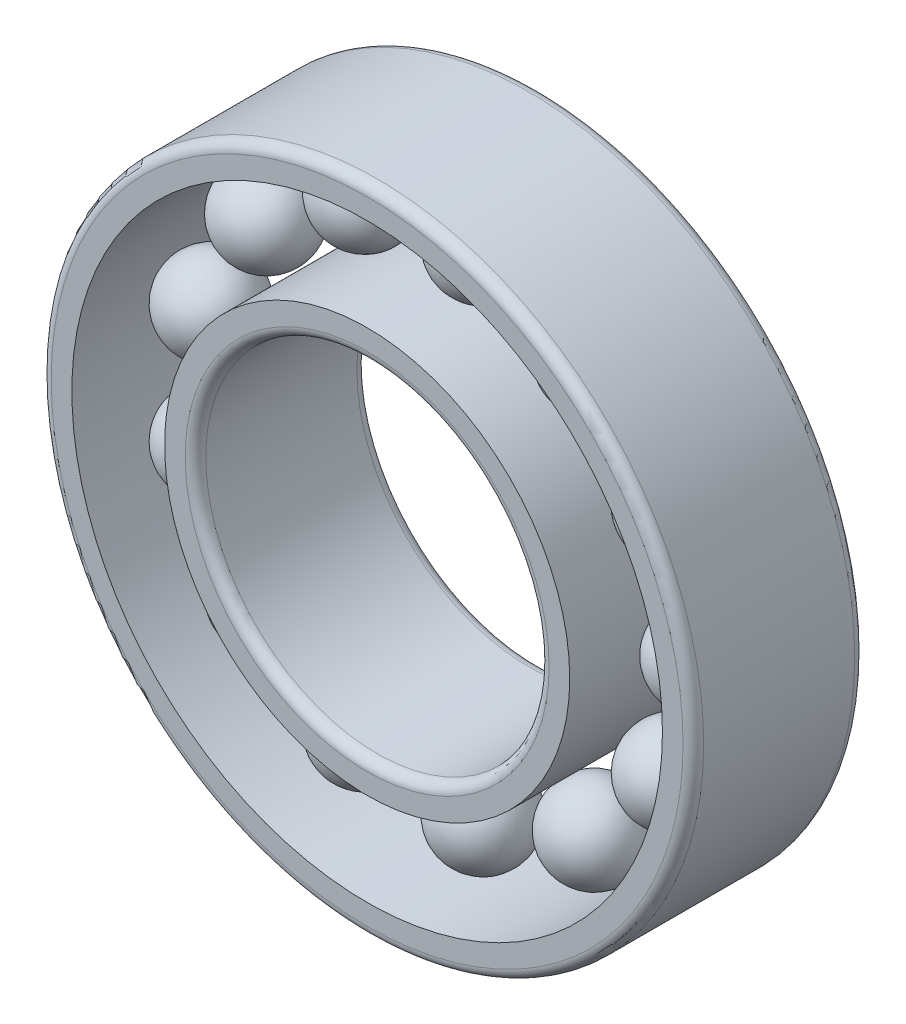
ISO-10303-21;
HEADER;
FILE_DESCRIPTION(('STEP AP214'),'2;1');
FILE_NAME('part.step','',(''),(''),'','','');
FILE_SCHEMA(('AUTOMOTIVE_DESIGN { 1 0 10303 214 1 1 1 1 }'));
ENDSEC;
DATA;
#1=APPLICATION_CONTEXT('core data for automotive mechanical design processes');
#2=APPLICATION_PROTOCOL_DEFINITION('international standard','automotive_design',2000,#1);
#3=PRODUCT_CONTEXT('',#1,'mechanical');
#4=PRODUCT('Part','Part','',(#3));
#5=PRODUCT_RELATED_PRODUCT_CATEGORY('part','',(#4));
#6=PRODUCT_DEFINITION_FORMATION('','',#4);
#7=PRODUCT_DEFINITION_CONTEXT('part definition',#1,'design');
#8=PRODUCT_DEFINITION('design','',#6,#7);
#9=PRODUCT_DEFINITION_SHAPE('','',#8);
#10=(LENGTH_UNIT() NAMED_UNIT(*) SI_UNIT(.MILLI.,.METRE.));
#11=(NAMED_UNIT(*) PLANE_ANGLE_UNIT() SI_UNIT($,.RADIAN.));
#12=(NAMED_UNIT(*) SI_UNIT($,.STERADIAN.) SOLID_ANGLE_UNIT());
#13=UNCERTAINTY_MEASURE_WITH_UNIT(LENGTH_MEASURE(1.E-05),#10,'distance_accuracy_value','');
#14=(GEOMETRIC_REPRESENTATION_CONTEXT(3) GLOBAL_UNCERTAINTY_ASSIGNED_CONTEXT((#13)) GLOBAL_UNIT_ASSIGNED_CONTEXT((#10,
#11,#12)) REPRESENTATION_CONTEXT('',''));
#15=CARTESIAN_POINT('',(0.,0.,0.));
#16=DIRECTION('',(0.,0.,1.));
#17=DIRECTION('',(1.,0.,0.));
#18=AXIS2_PLACEMENT_3D('',#15,#16,#17);
#19=CARTESIAN_POINT('',(6.41955618598577,-3.36924299731733,0.));
#20=DIRECTION('',(-0.88545602565321,0.464723172043769,0.));
#21=DIRECTION('',(0.,0.,-1.));
#22=AXIS2_PLACEMENT_3D('',#19,#20,#21);
#23=SPHERICAL_SURFACE('',#22,1.2825);
#24=CARTESIAN_POINT('',(5.28395883308553,-2.77323552917119,0.));
#25=VERTEX_POINT('',#24);
#26=VERTEX_LOOP('',#25);
#27=FACE_BOUND('',#26,.T.);
#28=ADVANCED_FACE('F38',(#27),#23,.T.);
#29=CLOSED_SHELL('',(#28));
#30=MANIFOLD_SOLID_BREP('B2',#29);
#31=CARTESIAN_POINT('',(4.11846941380088,-5.96663302772901,0.));
#32=DIRECTION('',(-0.568064746731156,0.822983865893657,0.));
#33=DIRECTION('',(0.,0.,-1.));
#34=AXIS2_PLACEMENT_3D('',#31,#32,#33);
#35=SPHERICAL_SURFACE('',#34,1.2825);
#36=CARTESIAN_POINT('',(3.38992637611817,-4.9111562197204,0.));
#37=VERTEX_POINT('',#36);
#38=VERTEX_LOOP('',#37);
#39=FACE_BOUND('',#38,.T.);
#40=ADVANCED_FACE('F57',(#39),#35,.T.);
#41=CLOSED_SHELL('',(#40));
#42=MANIFOLD_SOLID_BREP('B6',#41);
#43=CARTESIAN_POINT('',(0.873890931851087,-7.19713933721089,0.));
#44=DIRECTION('',(-0.120536680255322,0.992708874098054,0.));
#45=DIRECTION('',(0.,0.,-1.));
#46=AXIS2_PLACEMENT_3D('',#43,#44,#45);
#47=SPHERICAL_SURFACE('',#46,1.2825);
#48=CARTESIAN_POINT('',(0.719302639423636,-5.92399020618014,0.));
#49=VERTEX_POINT('',#48);
#50=VERTEX_LOOP('',#49);
#51=FACE_BOUND('',#50,.T.);
#52=ADVANCED_FACE('F76',(#51),#47,.T.);
#53=CLOSED_SHELL('',(#52));
#54=MANIFOLD_SOLID_BREP('B34',#53);
#55=CARTESIAN_POINT('',(-2.57088543105839,-6.77886775946926,0.));
#56=DIRECTION('',(0.354604887042536,0.935016242685415,0.));
#57=DIRECTION('',(0.,0.,-1.));
#58=AXIS2_PLACEMENT_3D('',#55,#56,#57);
#59=SPHERICAL_SURFACE('',#58,1.2825);
#60=CARTESIAN_POINT('',(-2.11610466342633,-5.57970942822521,0.));
#61=VERTEX_POINT('',#60);
#62=VERTEX_LOOP('',#61);
#63=FACE_BOUND('',#62,.T.);
#64=ADVANCED_FACE('F95',(#63),#59,.T.);
#65=CLOSED_SHELL('',(#64));
#66=MANIFOLD_SOLID_BREP('B53',#65);
#67=CARTESIAN_POINT('',(-5.42670292424048,-4.80763927224576,0.));
#68=DIRECTION('',(0.748510748171101,0.663122658240795,0.));
#69=DIRECTION('',(0.,0.,-1.));
#70=AXIS2_PLACEMENT_3D('',#67,#68,#69);
#71=SPHERICAL_SURFACE('',#70,1.2825);
#72=CARTESIAN_POINT('',(-4.46673788971105,-3.95718446305194,0.));
#73=VERTEX_POINT('',#72);
#74=VERTEX_LOOP('',#73);
#75=FACE_BOUND('',#74,.T.);
#76=ADVANCED_FACE('F114',(#75),#71,.T.);
#77=CLOSED_SHELL('',(#76));
#78=MANIFOLD_SOLID_BREP('B72',#77);
#79=CARTESIAN_POINT('',(-7.03932817633888,-1.73503856608479,0.));
#80=DIRECTION('',(0.970941817426052,0.239315664287557,0.));
#81=DIRECTION('',(0.,0.,-1.));
#82=AXIS2_PLACEMENT_3D('',#79,#80,#81);
#83=SPHERICAL_SURFACE('',#82,1.2825);
#84=CARTESIAN_POINT('',(-5.79409529548997,-1.428116226636,0.));
#85=VERTEX_POINT('',#84);
#86=VERTEX_LOOP('',#85);
#87=FACE_BOUND('',#86,.T.);
#88=ADVANCED_FACE('F133',(#87),#83,.T.);
#89=CLOSED_SHELL('',(#88));
#90=MANIFOLD_SOLID_BREP('B91',#89);
#91=CARTESIAN_POINT('',(-7.03932817633888,1.7350385660848,0.));
#92=DIRECTION('',(0.970941817426052,-0.239315664287558,0.));
#93=DIRECTION('',(0.,0.,-1.));
#94=AXIS2_PLACEMENT_3D('',#91,#92,#93);
#95=SPHERICAL_SURFACE('',#94,1.2825);
#96=CARTESIAN_POINT('',(-5.79409529548997,1.428116226636,0.));
#97=VERTEX_POINT('',#96);
#98=VERTEX_LOOP('',#97);
#99=FACE_BOUND('',#98,.T.);
#100=ADVANCED_FACE('F152',(#99),#95,.T.);
#101=CLOSED_SHELL('',(#100));
#102=MANIFOLD_SOLID_BREP('B110',#101);
#103=CARTESIAN_POINT('',(-5.42670292424048,4.80763927224577,0.));
#104=DIRECTION('',(0.748510748171101,-0.663122658240796,0.));
#105=DIRECTION('',(0.,0.,-1.));
#106=AXIS2_PLACEMENT_3D('',#103,#104,#105);
#107=SPHERICAL_SURFACE('',#106,1.2825);
#108=CARTESIAN_POINT('',(-4.46673788971105,3.95718446305195,0.));
#109=VERTEX_POINT('',#108);
#110=VERTEX_LOOP('',#109);
#111=FACE_BOUND('',#110,.T.);
#112=ADVANCED_FACE('F171',(#111),#107,.T.);
#113=CLOSED_SHELL('',(#112));
#114=MANIFOLD_SOLID_BREP('B129',#113);
#115=CARTESIAN_POINT('',(-2.57088543105838,6.77886775946926,0.));
#116=DIRECTION('',(0.354604887042536,-0.935016242685415,0.));
#117=DIRECTION('',(0.,0.,-1.));
#118=AXIS2_PLACEMENT_3D('',#115,#116,#117);
#119=SPHERICAL_SURFACE('',#118,1.2825);
#120=CARTESIAN_POINT('',(-2.11610466342633,5.57970942822522,0.));
#121=VERTEX_POINT('',#120);
#122=VERTEX_LOOP('',#121);
#123=FACE_BOUND('',#122,.T.);
#124=ADVANCED_FACE('F190',(#123),#119,.T.);
#125=CLOSED_SHELL('',(#124));
#126=MANIFOLD_SOLID_BREP('B148',#125);
#127=CARTESIAN_POINT('',(0.873890931851093,7.19713933721089,0.));
#128=DIRECTION('',(-0.120536680255323,-0.992708874098054,0.));
#129=DIRECTION('',(0.,0.,-1.));
#130=AXIS2_PLACEMENT_3D('',#127,#128,#129);
#131=SPHERICAL_SURFACE('',#130,1.2825);
#132=CARTESIAN_POINT('',(0.719302639423642,5.92399020618014,0.));
#133=VERTEX_POINT('',#132);
#134=VERTEX_LOOP('',#133);
#135=FACE_BOUND('',#134,.T.);
#136=ADVANCED_FACE('F209',(#135),#131,.T.);
#137=CLOSED_SHELL('',(#136));
#138=MANIFOLD_SOLID_BREP('B167',#137);
#139=CARTESIAN_POINT('',(4.11846941380088,5.96663302772901,0.));
#140=DIRECTION('',(-0.568064746731156,-0.822983865893656,0.));
#141=DIRECTION('',(0.,0.,-1.));
#142=AXIS2_PLACEMENT_3D('',#139,#140,#141);
#143=SPHERICAL_SURFACE('',#142,1.2825);
#144=CARTESIAN_POINT('',(3.38992637611817,4.9111562197204,0.));
#145=VERTEX_POINT('',#144);
#146=VERTEX_LOOP('',#145);
#147=FACE_BOUND('',#146,.T.);
#148=ADVANCED_FACE('F228',(#147),#143,.T.);
#149=CLOSED_SHELL('',(#148));
#150=MANIFOLD_SOLID_BREP('B186',#149);
#151=CARTESIAN_POINT('',(6.41955618598577,3.36924299731732,0.));
#152=DIRECTION('',(-0.88545602565321,-0.464723172043769,0.));
#153=DIRECTION('',(0.,0.,-1.));
#154=AXIS2_PLACEMENT_3D('',#151,#152,#153);
#155=SPHERICAL_SURFACE('',#154,1.2825);
#156=CARTESIAN_POINT('',(5.28395883308553,2.77323552917119,0.));
#157=VERTEX_POINT('',#156);
#158=VERTEX_LOOP('',#157);
#159=FACE_BOUND('',#158,.T.);
#160=ADVANCED_FACE('F247',(#159),#155,.T.);
#161=CLOSED_SHELL('',(#160));
#162=MANIFOLD_SOLID_BREP('B205',#161);
#163=CARTESIAN_POINT('',(7.25,0.,0.));
#164=DIRECTION('',(-1.,0.,0.));
#165=DIRECTION('',(0.,0.,-1.));
#166=AXIS2_PLACEMENT_3D('',#163,#164,#165);
#167=SPHERICAL_SURFACE('',#166,1.2825);
#168=CARTESIAN_POINT('',(5.9675,0.,0.));
#169=VERTEX_POINT('',#168);
#170=VERTEX_LOOP('',#169);
#171=FACE_BOUND('',#170,.T.);
#172=ADVANCED_FACE('F268',(#171),#167,.T.);
#173=CLOSED_SHELL('',(#172));
#174=MANIFOLD_SOLID_BREP('B224',#173);
#175=CARTESIAN_POINT('',(0.,0.,4.75));
#176=DIRECTION('',(0.,0.,1.));
#177=DIRECTION('',(1.,0.,0.));
#178=AXIS2_PLACEMENT_3D('',#175,#176,#177);
#179=CYLINDRICAL_SURFACE('',#178,8.6);
#180=CARTESIAN_POINT('',(0.,0.,2.5));
#181=DIRECTION('',(0.,0.,1.));
#182=DIRECTION('',(1.,0.,0.));
#183=AXIS2_PLACEMENT_3D('',#180,#181,#182);
#184=CIRCLE('',#183,8.6);
#185=CARTESIAN_POINT('',(8.6,0.,2.5));
#186=VERTEX_POINT('',#185);
#187=EDGE_CURVE('E308',#186,#186,#184,.T.);
#188=ORIENTED_EDGE('',*,*,#187,.T.);
#189=EDGE_LOOP('',(#188));
#190=FACE_BOUND('',#189,.T.);
#191=CARTESIAN_POINT('',(0.,0.,-2.5));
#192=DIRECTION('',(0.,0.,1.));
#193=DIRECTION('',(1.,0.,0.));
#194=AXIS2_PLACEMENT_3D('',#191,#192,#193);
#195=CIRCLE('',#194,8.6);
#196=CARTESIAN_POINT('',(8.6,0.,-2.5));
#197=VERTEX_POINT('',#196);
#198=EDGE_CURVE('E311',#197,#197,#195,.T.);
#199=ORIENTED_EDGE('',*,*,#198,.F.);
#200=EDGE_LOOP('',(#199));
#201=FACE_BOUND('',#200,.T.);
#202=ADVANCED_FACE('F288',(#190,#201),#179,.F.);
#203=CARTESIAN_POINT('',(8.6,0.,2.5));
#204=DIRECTION('',(0.,0.,1.));
#205=DIRECTION('',(1.,0.,0.));
#206=AXIS2_PLACEMENT_3D('',#203,#204,#205);
#207=PLANE('',#206);
#208=CARTESIAN_POINT('',(0.,0.,2.5));
#209=DIRECTION('',(0.,0.,1.));
#210=DIRECTION('',(1.,0.,0.));
#211=AXIS2_PLACEMENT_3D('',#208,#209,#210);
#212=CIRCLE('',#211,9.2);
#213=CARTESIAN_POINT('',(9.2,0.,2.5));
#214=VERTEX_POINT('',#213);
#215=EDGE_CURVE('E267',#214,#214,#212,.T.);
#216=ORIENTED_EDGE('',*,*,#215,.T.);
#217=EDGE_LOOP('',(#216));
#218=FACE_BOUND('',#217,.T.);
#219=ORIENTED_EDGE('',*,*,#187,.F.);
#220=EDGE_LOOP('',(#219));
#221=FACE_BOUND('',#220,.T.);
#222=ADVANCED_FACE('F318',(#218,#221),#207,.T.);
#223=CARTESIAN_POINT('',(0.,0.,4.75));
#224=DIRECTION('',(0.,0.,1.));
#225=DIRECTION('',(1.,0.,0.));
#226=AXIS2_PLACEMENT_3D('',#223,#224,#225);
#227=CYLINDRICAL_SURFACE('',#226,9.5);
#228=CARTESIAN_POINT('',(0.,0.,-2.2));
#229=DIRECTION('',(0.,0.,-1.));
#230=DIRECTION('',(-1.,0.,0.));
#231=AXIS2_PLACEMENT_3D('',#228,#229,#230);
#232=CIRCLE('',#231,9.5);
#233=CARTESIAN_POINT('',(-9.5,0.,-2.2));
#234=VERTEX_POINT('',#233);
#235=EDGE_CURVE('E299',#234,#234,#232,.F.);
#236=ORIENTED_EDGE('',*,*,#235,.T.);
#237=EDGE_LOOP('',(#236));
#238=FACE_BOUND('',#237,.T.);
#239=CARTESIAN_POINT('',(0.,0.,2.2));
#240=DIRECTION('',(0.,0.,1.));
#241=DIRECTION('',(1.,0.,0.));
#242=AXIS2_PLACEMENT_3D('',#239,#240,#241);
#243=CIRCLE('',#242,9.5);
#244=CARTESIAN_POINT('',(9.5,0.,2.2));
#245=VERTEX_POINT('',#244);
#246=EDGE_CURVE('E303',#245,#245,#243,.F.);
#247=ORIENTED_EDGE('',*,*,#246,.T.);
#248=EDGE_LOOP('',(#247));
#249=FACE_BOUND('',#248,.T.);
#250=ADVANCED_FACE('F324',(#238,#249),#227,.T.);
#251=CARTESIAN_POINT('',(9.5,0.,-2.5));
#252=DIRECTION('',(0.,0.,-1.));
#253=DIRECTION('',(-1.,0.,0.));
#254=AXIS2_PLACEMENT_3D('',#251,#252,#253);
#255=PLANE('',#254);
#256=CARTESIAN_POINT('',(0.,0.,-2.5));
#257=DIRECTION('',(0.,0.,-1.));
#258=DIRECTION('',(-1.,0.,0.));
#259=AXIS2_PLACEMENT_3D('',#256,#257,#258);
#260=CIRCLE('',#259,9.2);
#261=CARTESIAN_POINT('',(-9.2,0.,-2.5));
#262=VERTEX_POINT('',#261);
#263=EDGE_CURVE('E295',#262,#262,#260,.T.);
#264=ORIENTED_EDGE('',*,*,#263,.T.);
#265=EDGE_LOOP('',(#264));
#266=FACE_BOUND('',#265,.T.);
#267=ORIENTED_EDGE('',*,*,#198,.T.);
#268=EDGE_LOOP('',(#267));
#269=FACE_BOUND('',#268,.T.);
#270=ADVANCED_FACE('F315',(#266,#269),#255,.T.);
#271=CARTESIAN_POINT('',(0.,0.,-2.2));
#272=DIRECTION('',(0.,0.,-1.));
#273=DIRECTION('',(-1.,0.,0.));
#274=AXIS2_PLACEMENT_3D('',#271,#272,#273);
#275=TOROIDAL_SURFACE('',#274,9.2,0.3);
#276=ORIENTED_EDGE('',*,*,#263,.F.);
#277=EDGE_LOOP('',(#276));
#278=FACE_BOUND('',#277,.T.);
#279=ORIENTED_EDGE('',*,*,#235,.F.);
#280=EDGE_LOOP('',(#279));
#281=FACE_BOUND('',#280,.T.);
#282=ADVANCED_FACE('F327',(#278,#281),#275,.T.);
#283=CARTESIAN_POINT('',(0.,0.,2.2));
#284=DIRECTION('',(0.,0.,1.));
#285=DIRECTION('',(1.,0.,0.));
#286=AXIS2_PLACEMENT_3D('',#283,#284,#285);
#287=TOROIDAL_SURFACE('',#286,9.2,0.3);
#288=ORIENTED_EDGE('',*,*,#246,.F.);
#289=EDGE_LOOP('',(#288));
#290=FACE_BOUND('',#289,.T.);
#291=ORIENTED_EDGE('',*,*,#215,.F.);
#292=EDGE_LOOP('',(#291));
#293=FACE_BOUND('',#292,.T.);
#294=ADVANCED_FACE('F290',(#290,#293),#287,.T.);
#295=CLOSED_SHELL('',(#202,#222,#250,#270,#282,#294));
#296=MANIFOLD_SOLID_BREP('B243',#295);
#297=CARTESIAN_POINT('',(0.,0.,4.75));
#298=DIRECTION('',(0.,0.,1.));
#299=DIRECTION('',(1.,0.,0.));
#300=AXIS2_PLACEMENT_3D('',#297,#298,#299);
#301=CYLINDRICAL_SURFACE('',#300,5.);
#302=CARTESIAN_POINT('',(0.,0.,-2.2));
#303=DIRECTION('',(0.,0.,-1.));
#304=DIRECTION('',(-1.,0.,0.));
#305=AXIS2_PLACEMENT_3D('',#302,#303,#304);
#306=CIRCLE('',#305,5.);
#307=CARTESIAN_POINT('',(-5.,0.,-2.2));
#308=VERTEX_POINT('',#307);
#309=EDGE_CURVE('E387',#308,#308,#306,.T.);
#310=ORIENTED_EDGE('',*,*,#309,.T.);
#311=EDGE_LOOP('',(#310));
#312=FACE_BOUND('',#311,.T.);
#313=CARTESIAN_POINT('',(0.,0.,2.2));
#314=DIRECTION('',(0.,0.,1.));
#315=DIRECTION('',(1.,0.,0.));
#316=AXIS2_PLACEMENT_3D('',#313,#314,#315);
#317=CIRCLE('',#316,5.);
#318=CARTESIAN_POINT('',(5.,0.,2.2));
#319=VERTEX_POINT('',#318);
#320=EDGE_CURVE('E391',#319,#319,#317,.T.);
#321=ORIENTED_EDGE('',*,*,#320,.T.);
#322=EDGE_LOOP('',(#321));
#323=FACE_BOUND('',#322,.T.);
#324=ADVANCED_FACE('F380',(#312,#323),#301,.F.);
#325=CARTESIAN_POINT('',(5.,0.,2.5));
#326=DIRECTION('',(0.,0.,1.));
#327=DIRECTION('',(1.,0.,0.));
#328=AXIS2_PLACEMENT_3D('',#325,#326,#327);
#329=PLANE('',#328);
#330=CARTESIAN_POINT('',(0.,0.,2.5));
#331=DIRECTION('',(0.,0.,1.));
#332=DIRECTION('',(1.,0.,0.));
#333=AXIS2_PLACEMENT_3D('',#330,#331,#332);
#334=CIRCLE('',#333,5.3);
#335=CARTESIAN_POINT('',(5.3,0.,2.5));
#336=VERTEX_POINT('',#335);
#337=EDGE_CURVE('E287',#336,#336,#334,.F.);
#338=ORIENTED_EDGE('',*,*,#337,.T.);
#339=EDGE_LOOP('',(#338));
#340=FACE_BOUND('',#339,.T.);
#341=CARTESIAN_POINT('',(0.,0.,2.5));
#342=DIRECTION('',(0.,0.,1.));
#343=DIRECTION('',(1.,0.,0.));
#344=AXIS2_PLACEMENT_3D('',#341,#342,#343);
#345=CIRCLE('',#344,5.9);
#346=CARTESIAN_POINT('',(5.9,0.,2.5));
#347=VERTEX_POINT('',#346);
#348=EDGE_CURVE('E400',#347,#347,#345,.T.);
#349=ORIENTED_EDGE('',*,*,#348,.T.);
#350=EDGE_LOOP('',(#349));
#351=FACE_BOUND('',#350,.T.);
#352=ADVANCED_FACE('F420',(#340,#351),#329,.T.);
#353=CARTESIAN_POINT('',(0.,0.,4.75));
#354=DIRECTION('',(0.,0.,1.));
#355=DIRECTION('',(1.,0.,0.));
#356=AXIS2_PLACEMENT_3D('',#353,#354,#355);
#357=CYLINDRICAL_SURFACE('',#356,5.9);
#358=CARTESIAN_POINT('',(0.,0.,-2.5));
#359=DIRECTION('',(0.,0.,1.));
#360=DIRECTION('',(1.,0.,0.));
#361=AXIS2_PLACEMENT_3D('',#358,#359,#360);
#362=CIRCLE('',#361,5.9);
#363=CARTESIAN_POINT('',(5.9,0.,-2.5));
#364=VERTEX_POINT('',#363);
#365=EDGE_CURVE('E403',#364,#364,#362,.T.);
#366=ORIENTED_EDGE('',*,*,#365,.T.);
#367=EDGE_LOOP('',(#366));
#368=FACE_BOUND('',#367,.T.);
#369=ORIENTED_EDGE('',*,*,#348,.F.);
#370=EDGE_LOOP('',(#369));
#371=FACE_BOUND('',#370,.T.);
#372=ADVANCED_FACE('F407',(#368,#371),#357,.T.);
#373=CARTESIAN_POINT('',(5.9,0.,-2.5));
#374=DIRECTION('',(0.,0.,-1.));
#375=DIRECTION('',(-1.,0.,0.));
#376=AXIS2_PLACEMENT_3D('',#373,#374,#375);
#377=PLANE('',#376);
#378=CARTESIAN_POINT('',(0.,0.,-2.5));
#379=DIRECTION('',(0.,0.,-1.));
#380=DIRECTION('',(-1.,0.,0.));
#381=AXIS2_PLACEMENT_3D('',#378,#379,#380);
#382=CIRCLE('',#381,5.3);
#383=CARTESIAN_POINT('',(-5.3,0.,-2.5));
#384=VERTEX_POINT('',#383);
#385=EDGE_CURVE('E395',#384,#384,#382,.F.);
#386=ORIENTED_EDGE('',*,*,#385,.T.);
#387=EDGE_LOOP('',(#386));
#388=FACE_BOUND('',#387,.T.);
#389=ORIENTED_EDGE('',*,*,#365,.F.);
#390=EDGE_LOOP('',(#389));
#391=FACE_BOUND('',#390,.T.);
#392=ADVANCED_FACE('F410',(#388,#391),#377,.T.);
#393=CARTESIAN_POINT('',(0.,0.,-2.2));
#394=DIRECTION('',(0.,0.,-1.));
#395=DIRECTION('',(-1.,0.,0.));
#396=AXIS2_PLACEMENT_3D('',#393,#394,#395);
#397=TOROIDAL_SURFACE('',#396,5.3,0.3);
#398=ORIENTED_EDGE('',*,*,#309,.F.);
#399=EDGE_LOOP('',(#398));
#400=FACE_BOUND('',#399,.T.);
#401=ORIENTED_EDGE('',*,*,#385,.F.);
#402=EDGE_LOOP('',(#401));
#403=FACE_BOUND('',#402,.T.);
#404=ADVANCED_FACE('F412',(#400,#403),#397,.T.);
#405=CARTESIAN_POINT('',(0.,0.,2.2));
#406=DIRECTION('',(0.,0.,1.));
#407=DIRECTION('',(1.,0.,0.));
#408=AXIS2_PLACEMENT_3D('',#405,#406,#407);
#409=TOROIDAL_SURFACE('',#408,5.3,0.3);
#410=ORIENTED_EDGE('',*,*,#337,.F.);
#411=EDGE_LOOP('',(#410));
#412=FACE_BOUND('',#411,.T.);
#413=ORIENTED_EDGE('',*,*,#320,.F.);
#414=EDGE_LOOP('',(#413));
#415=FACE_BOUND('',#414,.T.);
#416=ADVANCED_FACE('F382',(#412,#415),#409,.T.);
#417=CLOSED_SHELL('',(#324,#352,#372,#392,#404,#416));
#418=MANIFOLD_SOLID_BREP('B262',#417);
#419=ADVANCED_BREP_SHAPE_REPRESENTATION('',(#18,#30,#42,#54,#66,#78,#90,#102,#114,#126,#138,
#150,#162,#174,#296,#418),#14);
#420=SHAPE_DEFINITION_REPRESENTATION(#9,#419);
ENDSEC;
END-ISO-10303-21;
